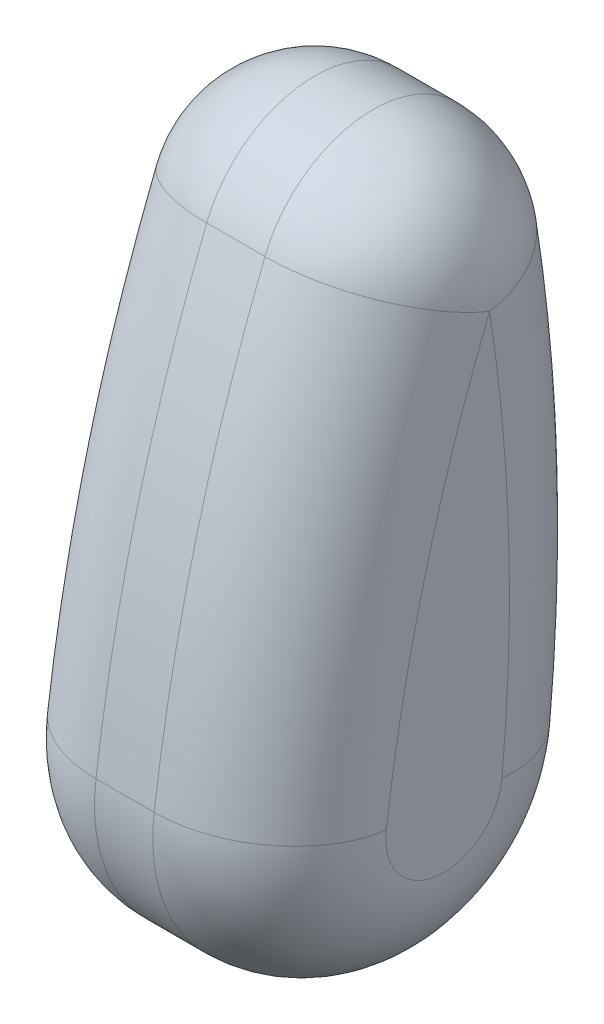
ISO-10303-21;
HEADER;
FILE_DESCRIPTION(('STEP AP214'),'2;1');
FILE_NAME('part.step','',(''),(''),'','','');
FILE_SCHEMA(('AUTOMOTIVE_DESIGN { 1 0 10303 214 1 1 1 1 }'));
ENDSEC;
DATA;
#1=APPLICATION_CONTEXT('core data for automotive mechanical design processes');
#2=APPLICATION_PROTOCOL_DEFINITION('international standard','automotive_design',2000,#1);
#3=PRODUCT_CONTEXT('',#1,'mechanical');
#4=PRODUCT('Part','Part','',(#3));
#5=PRODUCT_RELATED_PRODUCT_CATEGORY('part','',(#4));
#6=PRODUCT_DEFINITION_FORMATION('','',#4);
#7=PRODUCT_DEFINITION_CONTEXT('part definition',#1,'design');
#8=PRODUCT_DEFINITION('design','',#6,#7);
#9=PRODUCT_DEFINITION_SHAPE('','',#8);
#10=(LENGTH_UNIT() NAMED_UNIT(*) SI_UNIT(.MILLI.,.METRE.));
#11=(NAMED_UNIT(*) PLANE_ANGLE_UNIT() SI_UNIT($,.RADIAN.));
#12=(NAMED_UNIT(*) SI_UNIT($,.STERADIAN.) SOLID_ANGLE_UNIT());
#13=UNCERTAINTY_MEASURE_WITH_UNIT(LENGTH_MEASURE(1.E-05),#10,'distance_accuracy_value','');
#14=(GEOMETRIC_REPRESENTATION_CONTEXT(3) GLOBAL_UNCERTAINTY_ASSIGNED_CONTEXT((#13)) GLOBAL_UNIT_ASSIGNED_CONTEXT((#10,
#11,#12)) REPRESENTATION_CONTEXT('',''));
#15=CARTESIAN_POINT('',(0.,0.,0.));
#16=DIRECTION('',(0.,0.,1.));
#17=DIRECTION('',(1.,0.,0.));
#18=AXIS2_PLACEMENT_3D('',#15,#16,#17);
#19=CARTESIAN_POINT('',(63.5,105.260529814736,-686.134802304539));
#20=DIRECTION('',(-1.,0.,0.));
#21=DIRECTION('',(0.,0.,1.));
#22=AXIS2_PLACEMENT_3D('',#19,#20,#21);
#23=CYLINDRICAL_SURFACE('',#22,762.);
#24=DIRECTION('',(-1.,0.,0.));
#25=VECTOR('',#24,1.);
#26=CARTESIAN_POINT('',(63.5,388.31512238001,21.3424748059756));
#27=LINE('',#26,#25);
#28=CARTESIAN_POINT('',(12.7,388.31512238001,21.3424748059756));
#29=VERTEX_POINT('',#28);
#30=CARTESIAN_POINT('',(-12.7,388.31512238001,21.3424748059756));
#31=VERTEX_POINT('',#30);
#32=EDGE_CURVE('E138',#29,#31,#27,.T.);
#33=ORIENTED_EDGE('',*,*,#32,.T.);
#34=CARTESIAN_POINT('',(-12.7,105.260529814736,-686.134802304539));
#35=DIRECTION('',(-1.,0.,0.));
#36=DIRECTION('',(0.,0.,1.));
#37=AXIS2_PLACEMENT_3D('',#34,#35,#36);
#38=CIRCLE('',#37,762.);
#39=CARTESIAN_POINT('',(-12.7,202.482225769918,69.6376117432345));
#40=VERTEX_POINT('',#39);
#41=EDGE_CURVE('E157',#31,#40,#38,.F.);
#42=ORIENTED_EDGE('',*,*,#41,.T.);
#43=DIRECTION('',(-1.,0.,0.));
#44=VECTOR('',#43,1.);
#45=CARTESIAN_POINT('',(63.5,202.482225769918,69.6376117432345));
#46=LINE('',#45,#44);
#47=CARTESIAN_POINT('',(12.7,202.482225769918,69.6376117432345));
#48=VERTEX_POINT('',#47);
#49=EDGE_CURVE('E111',#48,#40,#46,.T.);
#50=ORIENTED_EDGE('',*,*,#49,.F.);
#51=CARTESIAN_POINT('',(12.7,105.260529814736,-686.134802304539));
#52=DIRECTION('',(-1.,0.,0.));
#53=DIRECTION('',(0.,0.,1.));
#54=AXIS2_PLACEMENT_3D('',#51,#52,#53);
#55=CIRCLE('',#54,762.);
#56=EDGE_CURVE('E155',#48,#29,#55,.T.);
#57=ORIENTED_EDGE('',*,*,#56,.T.);
#58=EDGE_LOOP('',(#33,#42,#50,#57));
#59=FACE_BOUND('',#58,.T.);
#60=ADVANCED_FACE('F33',(#59),#23,.T.);
#61=CARTESIAN_POINT('',(63.5,192.760056174399,-5.93962966154271));
#62=DIRECTION('',(-1.,0.,0.));
#63=DIRECTION('',(0.,0.,1.));
#64=AXIS2_PLACEMENT_3D('',#61,#62,#63);
#65=CYLINDRICAL_SURFACE('',#64,76.2);
#66=ORIENTED_EDGE('',*,*,#49,.T.);
#67=CARTESIAN_POINT('',(-12.7,192.760056174399,-5.93962966154271));
#68=DIRECTION('',(-1.,0.,0.));
#69=DIRECTION('',(0.,0.,1.));
#70=AXIS2_PLACEMENT_3D('',#67,#68,#69);
#71=CIRCLE('',#70,76.2);
#72=CARTESIAN_POINT('',(-12.7,185.441760865066,-81.7873887172023));
#73=VERTEX_POINT('',#72);
#74=EDGE_CURVE('E110',#40,#73,#71,.F.);
#75=ORIENTED_EDGE('',*,*,#74,.T.);
#76=DIRECTION('',(-1.,0.,0.));
#77=VECTOR('',#76,1.);
#78=CARTESIAN_POINT('',(63.5,185.441760865066,-81.7873887172023));
#79=LINE('',#78,#77);
#80=CARTESIAN_POINT('',(12.7,185.441760865066,-81.7873887172023));
#81=VERTEX_POINT('',#80);
#82=EDGE_CURVE('E92',#81,#73,#79,.T.);
#83=ORIENTED_EDGE('',*,*,#82,.F.);
#84=CARTESIAN_POINT('',(12.7,192.760056174399,-5.93962966154271));
#85=DIRECTION('',(-1.,0.,0.));
#86=DIRECTION('',(0.,0.,1.));
#87=AXIS2_PLACEMENT_3D('',#84,#85,#86);
#88=CIRCLE('',#87,76.2);
#89=EDGE_CURVE('E107',#81,#48,#88,.T.);
#90=ORIENTED_EDGE('',*,*,#89,.T.);
#91=EDGE_LOOP('',(#66,#75,#83,#90));
#92=FACE_BOUND('',#91,.T.);
#93=ADVANCED_FACE('F106',(#92),#65,.T.);
#94=CARTESIAN_POINT('',(63.5,258.624713958398,676.690201839394));
#95=DIRECTION('',(-1.,0.,0.));
#96=DIRECTION('',(0.,0.,1.));
#97=AXIS2_PLACEMENT_3D('',#94,#95,#96);
#98=CYLINDRICAL_SURFACE('',#97,762.);
#99=ORIENTED_EDGE('',*,*,#82,.T.);
#100=CARTESIAN_POINT('',(-12.7,258.624713958398,676.690201839394));
#101=DIRECTION('',(-1.,0.,0.));
#102=DIRECTION('',(0.,0.,1.));
#103=AXIS2_PLACEMENT_3D('',#100,#101,#102);
#104=CIRCLE('',#103,762.);
#105=CARTESIAN_POINT('',(-12.7,377.36053779832,-76.002168347162));
#106=VERTEX_POINT('',#105);
#107=EDGE_CURVE('E99',#73,#106,#104,.F.);
#108=ORIENTED_EDGE('',*,*,#107,.T.);
#109=DIRECTION('',(-1.,0.,0.));
#110=VECTOR('',#109,1.);
#111=CARTESIAN_POINT('',(63.5,377.36053779832,-76.002168347162));
#112=LINE('',#111,#110);
#113=CARTESIAN_POINT('',(12.7,377.36053779832,-76.002168347162));
#114=VERTEX_POINT('',#113);
#115=EDGE_CURVE('E94',#114,#106,#112,.T.);
#116=ORIENTED_EDGE('',*,*,#115,.F.);
#117=CARTESIAN_POINT('',(12.7,258.624713958398,676.690201839394));
#118=DIRECTION('',(-1.,0.,0.));
#119=DIRECTION('',(0.,0.,1.));
#120=AXIS2_PLACEMENT_3D('',#117,#118,#119);
#121=CIRCLE('',#120,762.);
#122=EDGE_CURVE('E89',#114,#81,#121,.T.);
#123=ORIENTED_EDGE('',*,*,#122,.T.);
#124=EDGE_LOOP('',(#99,#108,#116,#123));
#125=FACE_BOUND('',#124,.T.);
#126=ADVANCED_FACE('F91',(#125),#98,.T.);
#127=CARTESIAN_POINT('',(63.5,369.444816208991,-25.8226770013918));
#128=DIRECTION('',(-1.,0.,0.));
#129=DIRECTION('',(0.,0.,1.));
#130=AXIS2_PLACEMENT_3D('',#127,#128,#129);
#131=CYLINDRICAL_SURFACE('',#130,50.7999999999998);
#132=ORIENTED_EDGE('',*,*,#115,.T.);
#133=CARTESIAN_POINT('',(-12.7,369.444816208991,-25.8226770013918));
#134=DIRECTION('',(-1.,0.,0.));
#135=DIRECTION('',(0.,0.,1.));
#136=AXIS2_PLACEMENT_3D('',#133,#134,#135);
#137=CIRCLE('',#136,50.7999999999998);
#138=EDGE_CURVE('E153',#106,#31,#137,.F.);
#139=ORIENTED_EDGE('',*,*,#138,.T.);
#140=ORIENTED_EDGE('',*,*,#32,.F.);
#141=CARTESIAN_POINT('',(12.7,369.444816208991,-25.8226770013918));
#142=DIRECTION('',(-1.,0.,0.));
#143=DIRECTION('',(0.,0.,1.));
#144=AXIS2_PLACEMENT_3D('',#141,#142,#143);
#145=CIRCLE('',#144,50.7999999999998);
#146=EDGE_CURVE('E151',#29,#114,#145,.T.);
#147=ORIENTED_EDGE('',*,*,#146,.T.);
#148=EDGE_LOOP('',(#132,#139,#140,#147));
#149=FACE_BOUND('',#148,.T.);
#150=ADVANCED_FACE('F178',(#149),#131,.T.);
#151=CARTESIAN_POINT('',(63.5,237.352673011864,-355.978739652965));
#152=DIRECTION('',(-1.,0.,0.));
#153=DIRECTION('',(0.,0.,1.));
#154=AXIS2_PLACEMENT_3D('',#151,#152,#153);
#155=PLANE('',#154);
#156=CARTESIAN_POINT('',(63.5,192.760056174399,-5.93962966154271));
#157=DIRECTION('',(-1.,0.,0.));
#158=DIRECTION('',(0.,0.,1.));
#159=AXIS2_PLACEMENT_3D('',#156,#157,#158);
#160=CIRCLE('',#159,25.4);
#161=CARTESIAN_POINT('',(63.5,196.000779372905,19.2527841400497));
#162=VERTEX_POINT('',#161);
#163=CARTESIAN_POINT('',(63.5,190.320624404622,-31.2222160134292));
#164=VERTEX_POINT('',#163);
#165=EDGE_CURVE('E40',#162,#164,#160,.F.);
#166=ORIENTED_EDGE('',*,*,#165,.T.);
#167=CARTESIAN_POINT('',(63.5,258.624713958398,676.690201839394));
#168=DIRECTION('',(-1.,0.,0.));
#169=DIRECTION('',(0.,0.,1.));
#170=AXIS2_PLACEMENT_3D('',#167,#168,#169);
#171=CIRCLE('',#170,711.2);
#172=CARTESIAN_POINT('',(63.5,369.444816208991,-25.8226770013918));
#173=VERTEX_POINT('',#172);
#174=EDGE_CURVE('E11',#164,#173,#171,.F.);
#175=ORIENTED_EDGE('',*,*,#174,.T.);
#176=CARTESIAN_POINT('',(63.5,105.260529814736,-686.134802304539));
#177=DIRECTION('',(-1.,0.,0.));
#178=DIRECTION('',(0.,0.,1.));
#179=AXIS2_PLACEMENT_3D('',#176,#177,#178);
#180=CIRCLE('',#179,711.2);
#181=EDGE_CURVE('E49',#173,#162,#180,.F.);
#182=ORIENTED_EDGE('',*,*,#181,.T.);
#183=EDGE_LOOP('',(#166,#175,#182));
#184=FACE_BOUND('',#183,.T.);
#185=ADVANCED_FACE('F185',(#184),#155,.F.);
#186=CARTESIAN_POINT('',(-63.5,237.352673011864,-355.978739652965));
#187=DIRECTION('',(-1.,0.,0.));
#188=DIRECTION('',(0.,0.,1.));
#189=AXIS2_PLACEMENT_3D('',#186,#187,#188);
#190=PLANE('',#189);
#191=CARTESIAN_POINT('',(-63.5,258.624713958398,676.690201839394));
#192=DIRECTION('',(-1.,0.,0.));
#193=DIRECTION('',(0.,0.,1.));
#194=AXIS2_PLACEMENT_3D('',#191,#192,#193);
#195=CIRCLE('',#194,711.2);
#196=CARTESIAN_POINT('',(-63.5,369.444816208991,-25.8226770013918));
#197=VERTEX_POINT('',#196);
#198=CARTESIAN_POINT('',(-63.5,190.320624404622,-31.2222160134292));
#199=VERTEX_POINT('',#198);
#200=EDGE_CURVE('E146',#197,#199,#195,.T.);
#201=ORIENTED_EDGE('',*,*,#200,.T.);
#202=CARTESIAN_POINT('',(-63.5,192.760056174399,-5.93962966154271));
#203=DIRECTION('',(-1.,0.,0.));
#204=DIRECTION('',(0.,0.,1.));
#205=AXIS2_PLACEMENT_3D('',#202,#203,#204);
#206=CIRCLE('',#205,25.4);
#207=CARTESIAN_POINT('',(-63.5,196.000779372905,19.2527841400497));
#208=VERTEX_POINT('',#207);
#209=EDGE_CURVE('E100',#199,#208,#206,.T.);
#210=ORIENTED_EDGE('',*,*,#209,.T.);
#211=CARTESIAN_POINT('',(-63.5,105.260529814736,-686.134802304539));
#212=DIRECTION('',(-1.,0.,0.));
#213=DIRECTION('',(0.,0.,1.));
#214=AXIS2_PLACEMENT_3D('',#211,#212,#213);
#215=CIRCLE('',#214,711.2);
#216=EDGE_CURVE('E144',#208,#197,#215,.T.);
#217=ORIENTED_EDGE('',*,*,#216,.T.);
#218=EDGE_LOOP('',(#201,#210,#217));
#219=FACE_BOUND('',#218,.T.);
#220=ADVANCED_FACE('F183',(#219),#190,.T.);
#221=CARTESIAN_POINT('',(-12.7,369.444816208991,-25.8226770013918));
#222=DIRECTION('',(0.,0.,1.));
#223=DIRECTION('',(1.,0.,0.));
#224=AXIS2_PLACEMENT_3D('',#221,#222,#223);
#225=SPHERICAL_SURFACE('',#224,50.8);
#226=CARTESIAN_POINT('',(-12.7,369.444816208991,-25.8226770013918));
#227=DIRECTION('',(0.,-0.987785262712015,-0.155821291128508));
#228=DIRECTION('',(0.,0.155821291128508,-0.987785262712015));
#229=AXIS2_PLACEMENT_3D('',#226,#227,#228);
#230=CIRCLE('',#229,50.8);
#231=EDGE_CURVE('E132',#197,#106,#230,.T.);
#232=ORIENTED_EDGE('',*,*,#231,.F.);
#233=CARTESIAN_POINT('',(-12.7,369.444816208991,-25.822677001392));
#234=DIRECTION('',(0.,-0.928447870223771,0.371462719901935));
#235=DIRECTION('',(0.,-0.371462719901935,-0.928447870223771));
#236=AXIS2_PLACEMENT_3D('',#233,#234,#235);
#237=CIRCLE('',#236,50.8);
#238=EDGE_CURVE('E135',#31,#197,#237,.T.);
#239=ORIENTED_EDGE('',*,*,#238,.F.);
#240=ORIENTED_EDGE('',*,*,#138,.F.);
#241=EDGE_LOOP('',(#232,#239,#240));
#242=FACE_BOUND('',#241,.T.);
#243=ADVANCED_FACE('F181',(#242),#225,.T.);
#244=CARTESIAN_POINT('',(-12.7,105.260529814736,-686.134802304539));
#245=DIRECTION('',(-1.,0.,0.));
#246=DIRECTION('',(0.,0.,1.));
#247=AXIS2_PLACEMENT_3D('',#244,#245,#246);
#248=TOROIDAL_SURFACE('',#247,711.2,50.8);
#249=ORIENTED_EDGE('',*,*,#238,.T.);
#250=ORIENTED_EDGE('',*,*,#216,.F.);
#251=CARTESIAN_POINT('',(-12.7,196.000779372905,19.2527841400496));
#252=DIRECTION('',(0.,-0.991827315023324,0.127587527500238));
#253=DIRECTION('',(0.,-0.127587527500238,-0.991827315023324));
#254=AXIS2_PLACEMENT_3D('',#251,#252,#253);
#255=CIRCLE('',#254,50.8);
#256=EDGE_CURVE('E125',#40,#208,#255,.T.);
#257=ORIENTED_EDGE('',*,*,#256,.F.);
#258=ORIENTED_EDGE('',*,*,#41,.F.);
#259=EDGE_LOOP('',(#249,#250,#257,#258));
#260=FACE_BOUND('',#259,.T.);
#261=ADVANCED_FACE('F166',(#260),#248,.T.);
#262=CARTESIAN_POINT('',(-12.7,258.624713958398,676.690201839394));
#263=DIRECTION('',(-1.,0.,0.));
#264=DIRECTION('',(0.,0.,1.));
#265=AXIS2_PLACEMENT_3D('',#262,#263,#264);
#266=TOROIDAL_SURFACE('',#265,711.2,50.8);
#267=ORIENTED_EDGE('',*,*,#231,.T.);
#268=ORIENTED_EDGE('',*,*,#107,.F.);
#269=CARTESIAN_POINT('',(-12.7,190.320624404622,-31.2222160134292));
#270=DIRECTION('',(0.,-0.995377415428604,0.0960406208573906));
#271=DIRECTION('',(0.,-0.0960406208573906,-0.995377415428604));
#272=AXIS2_PLACEMENT_3D('',#269,#270,#271);
#273=CIRCLE('',#272,50.8);
#274=EDGE_CURVE('E123',#199,#73,#273,.T.);
#275=ORIENTED_EDGE('',*,*,#274,.F.);
#276=ORIENTED_EDGE('',*,*,#200,.F.);
#277=EDGE_LOOP('',(#267,#268,#275,#276));
#278=FACE_BOUND('',#277,.T.);
#279=ADVANCED_FACE('F174',(#278),#266,.T.);
#280=CARTESIAN_POINT('',(-12.7,192.760056174399,-5.93962966154271));
#281=DIRECTION('',(-1.,0.,0.));
#282=DIRECTION('',(0.,0.,1.));
#283=AXIS2_PLACEMENT_3D('',#280,#281,#282);
#284=DEGENERATE_TOROIDAL_SURFACE('',#283,25.4,50.8,.T.);
#285=ORIENTED_EDGE('',*,*,#256,.T.);
#286=ORIENTED_EDGE('',*,*,#209,.F.);
#287=ORIENTED_EDGE('',*,*,#274,.T.);
#288=ORIENTED_EDGE('',*,*,#74,.F.);
#289=EDGE_LOOP('',(#285,#286,#287,#288));
#290=FACE_BOUND('',#289,.T.);
#291=ADVANCED_FACE('F169',(#290),#284,.T.);
#292=CARTESIAN_POINT('',(12.7,192.760056174399,-5.93962966154271));
#293=DIRECTION('',(-1.,0.,0.));
#294=DIRECTION('',(0.,0.,1.));
#295=AXIS2_PLACEMENT_3D('',#292,#293,#294);
#296=DEGENERATE_TOROIDAL_SURFACE('',#295,25.4,50.8,.T.);
#297=CARTESIAN_POINT('',(12.7,196.000779372905,19.2527841400497));
#298=DIRECTION('',(0.,0.991827315023324,-0.127587527500239));
#299=DIRECTION('',(0.,0.127587527500239,0.991827315023324));
#300=AXIS2_PLACEMENT_3D('',#297,#298,#299);
#301=CIRCLE('',#300,50.8);
#302=EDGE_CURVE('E119',#48,#162,#301,.T.);
#303=ORIENTED_EDGE('',*,*,#302,.F.);
#304=ORIENTED_EDGE('',*,*,#89,.F.);
#305=CARTESIAN_POINT('',(12.7,190.320624404622,-31.2222160134292));
#306=DIRECTION('',(0.,0.995377415428604,-0.0960406208573906));
#307=DIRECTION('',(0.,0.0960406208573906,0.995377415428604));
#308=AXIS2_PLACEMENT_3D('',#305,#306,#307);
#309=CIRCLE('',#308,50.8);
#310=EDGE_CURVE('E116',#164,#81,#309,.T.);
#311=ORIENTED_EDGE('',*,*,#310,.F.);
#312=ORIENTED_EDGE('',*,*,#165,.F.);
#313=EDGE_LOOP('',(#303,#304,#311,#312));
#314=FACE_BOUND('',#313,.T.);
#315=ADVANCED_FACE('F115',(#314),#296,.T.);
#316=CARTESIAN_POINT('',(12.7,258.624713958398,676.690201839394));
#317=DIRECTION('',(-1.,0.,0.));
#318=DIRECTION('',(0.,0.,1.));
#319=AXIS2_PLACEMENT_3D('',#316,#317,#318);
#320=TOROIDAL_SURFACE('',#319,711.2,50.8);
#321=ORIENTED_EDGE('',*,*,#310,.T.);
#322=ORIENTED_EDGE('',*,*,#122,.F.);
#323=CARTESIAN_POINT('',(12.7,369.444816208991,-25.8226770013916));
#324=DIRECTION('',(0.,0.987785262712015,0.155821291128508));
#325=DIRECTION('',(0.,-0.155821291128508,0.987785262712015));
#326=AXIS2_PLACEMENT_3D('',#323,#324,#325);
#327=CIRCLE('',#326,50.8);
#328=EDGE_CURVE('E127',#173,#114,#327,.T.);
#329=ORIENTED_EDGE('',*,*,#328,.F.);
#330=ORIENTED_EDGE('',*,*,#174,.F.);
#331=EDGE_LOOP('',(#321,#322,#329,#330));
#332=FACE_BOUND('',#331,.T.);
#333=ADVANCED_FACE('F122',(#332),#320,.T.);
#334=CARTESIAN_POINT('',(12.7,105.260529814736,-686.134802304539));
#335=DIRECTION('',(-1.,0.,0.));
#336=DIRECTION('',(0.,0.,1.));
#337=AXIS2_PLACEMENT_3D('',#334,#335,#336);
#338=TOROIDAL_SURFACE('',#337,711.2,50.8);
#339=ORIENTED_EDGE('',*,*,#302,.T.);
#340=ORIENTED_EDGE('',*,*,#181,.F.);
#341=CARTESIAN_POINT('',(12.7,369.444816208991,-25.822677001392));
#342=DIRECTION('',(0.,0.928447870223771,-0.371462719901934));
#343=DIRECTION('',(0.,0.371462719901934,0.928447870223771));
#344=AXIS2_PLACEMENT_3D('',#341,#342,#343);
#345=CIRCLE('',#344,50.8);
#346=EDGE_CURVE('E286',#29,#173,#345,.T.);
#347=ORIENTED_EDGE('',*,*,#346,.F.);
#348=ORIENTED_EDGE('',*,*,#56,.F.);
#349=EDGE_LOOP('',(#339,#340,#347,#348));
#350=FACE_BOUND('',#349,.T.);
#351=ADVANCED_FACE('F262',(#350),#338,.T.);
#352=CARTESIAN_POINT('',(12.7,369.444816208991,-25.8226770013918));
#353=DIRECTION('',(0.,0.,1.));
#354=DIRECTION('',(1.,0.,0.));
#355=AXIS2_PLACEMENT_3D('',#352,#353,#354);
#356=SPHERICAL_SURFACE('',#355,50.8);
#357=ORIENTED_EDGE('',*,*,#328,.T.);
#358=ORIENTED_EDGE('',*,*,#146,.F.);
#359=ORIENTED_EDGE('',*,*,#346,.T.);
#360=EDGE_LOOP('',(#357,#358,#359));
#361=FACE_BOUND('',#360,.T.);
#362=ADVANCED_FACE('F271',(#361),#356,.T.);
#363=CLOSED_SHELL('',(#60,#93,#126,#150,#185,#220,#243,#261,#279,#291,#315,#333,#351,#362));
#364=MANIFOLD_SOLID_BREP('B2',#363);
#365=ADVANCED_BREP_SHAPE_REPRESENTATION('',(#18,#364),#14);
#366=SHAPE_DEFINITION_REPRESENTATION(#9,#365);
ENDSEC;
END-ISO-10303-21;
